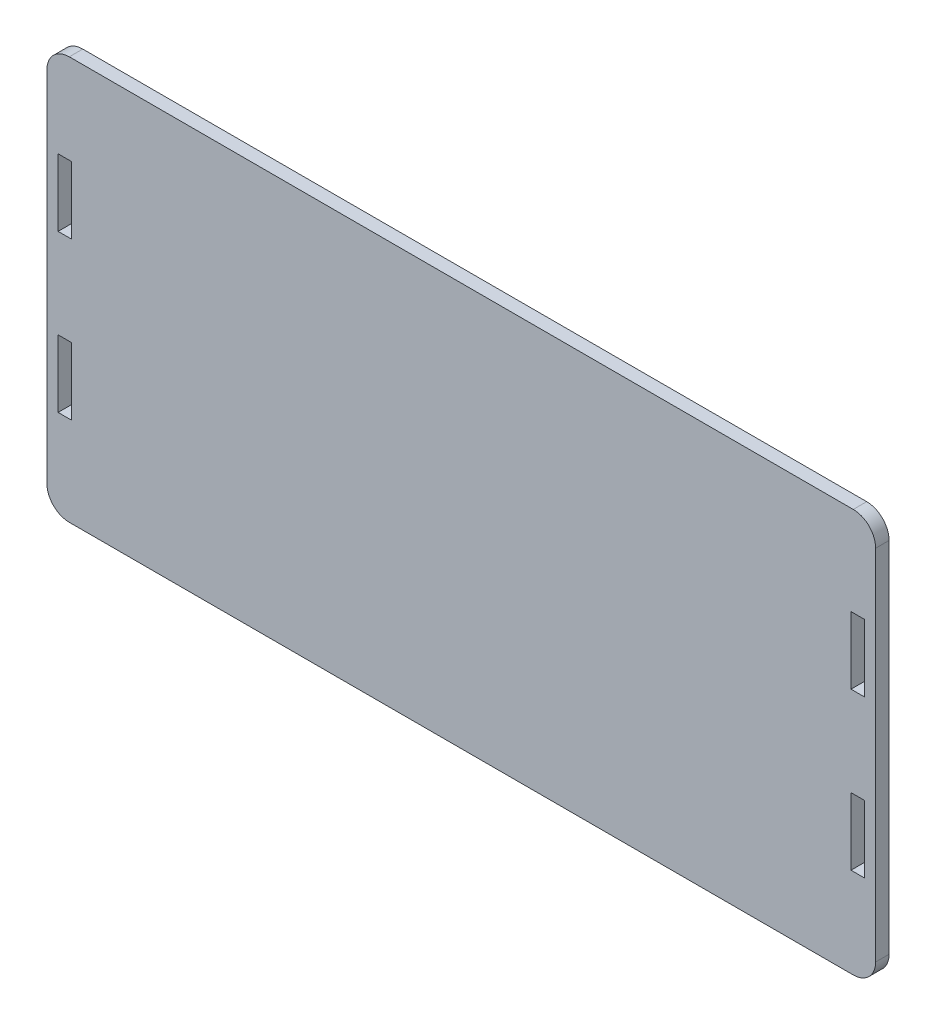
ISO-10303-21;
HEADER;
FILE_DESCRIPTION(('STEP AP214'),'2;1');
FILE_NAME('part.step','',(''),(''),'','','');
FILE_SCHEMA(('AUTOMOTIVE_DESIGN { 1 0 10303 214 1 1 1 1 }'));
ENDSEC;
DATA;
#1=APPLICATION_CONTEXT('core data for automotive mechanical design processes');
#2=APPLICATION_PROTOCOL_DEFINITION('international standard','automotive_design',2000,#1);
#3=PRODUCT_CONTEXT('',#1,'mechanical');
#4=PRODUCT('Part','Part','',(#3));
#5=PRODUCT_RELATED_PRODUCT_CATEGORY('part','',(#4));
#6=PRODUCT_DEFINITION_FORMATION('','',#4);
#7=PRODUCT_DEFINITION_CONTEXT('part definition',#1,'design');
#8=PRODUCT_DEFINITION('design','',#6,#7);
#9=PRODUCT_DEFINITION_SHAPE('','',#8);
#10=(LENGTH_UNIT() NAMED_UNIT(*) SI_UNIT(.MILLI.,.METRE.));
#11=(NAMED_UNIT(*) PLANE_ANGLE_UNIT() SI_UNIT($,.RADIAN.));
#12=(NAMED_UNIT(*) SI_UNIT($,.STERADIAN.) SOLID_ANGLE_UNIT());
#13=UNCERTAINTY_MEASURE_WITH_UNIT(LENGTH_MEASURE(1.E-05),#10,'distance_accuracy_value','');
#14=(GEOMETRIC_REPRESENTATION_CONTEXT(3) GLOBAL_UNCERTAINTY_ASSIGNED_CONTEXT((#13)) GLOBAL_UNIT_ASSIGNED_CONTEXT((#10,
#11,#12)) REPRESENTATION_CONTEXT('',''));
#15=CARTESIAN_POINT('',(0.,0.,0.));
#16=DIRECTION('',(0.,0.,1.));
#17=DIRECTION('',(1.,0.,0.));
#18=AXIS2_PLACEMENT_3D('',#15,#16,#17);
#19=CARTESIAN_POINT('',(0.,0.,6.));
#20=DIRECTION('',(1.,0.,0.));
#21=DIRECTION('',(0.,0.,-1.));
#22=AXIS2_PLACEMENT_3D('',#19,#20,#21);
#23=PLANE('',#22);
#24=DIRECTION('',(0.,-1.,0.));
#25=VECTOR('',#24,1.);
#26=CARTESIAN_POINT('',(0.,0.,6.));
#27=LINE('',#26,#25);
#28=CARTESIAN_POINT('',(0.,170.,6.));
#29=VERTEX_POINT('',#28);
#30=CARTESIAN_POINT('',(0.,10.,6.));
#31=VERTEX_POINT('',#30);
#32=EDGE_CURVE('E290',#29,#31,#27,.T.);
#33=ORIENTED_EDGE('',*,*,#32,.F.);
#34=DIRECTION('',(0.,0.,-1.));
#35=VECTOR('',#34,1.);
#36=CARTESIAN_POINT('',(0.,170.,6.));
#37=LINE('',#36,#35);
#38=CARTESIAN_POINT('',(0.,170.,0.));
#39=VERTEX_POINT('',#38);
#40=EDGE_CURVE('E346',#29,#39,#37,.T.);
#41=ORIENTED_EDGE('',*,*,#40,.T.);
#42=DIRECTION('',(0.,-1.,0.));
#43=VECTOR('',#42,1.);
#44=CARTESIAN_POINT('',(0.,0.,0.));
#45=LINE('',#44,#43);
#46=CARTESIAN_POINT('',(0.,10.,0.));
#47=VERTEX_POINT('',#46);
#48=EDGE_CURVE('E283',#39,#47,#45,.T.);
#49=ORIENTED_EDGE('',*,*,#48,.T.);
#50=DIRECTION('',(0.,0.,-1.));
#51=VECTOR('',#50,1.);
#52=CARTESIAN_POINT('',(0.,10.,6.));
#53=LINE('',#52,#51);
#54=EDGE_CURVE('E344',#47,#31,#53,.F.);
#55=ORIENTED_EDGE('',*,*,#54,.T.);
#56=EDGE_LOOP('',(#33,#41,#49,#55));
#57=FACE_BOUND('',#56,.T.);
#58=ADVANCED_FACE('F33',(#57),#23,.F.);
#59=CARTESIAN_POINT('',(0.,0.,6.));
#60=DIRECTION('',(0.,1.,0.));
#61=DIRECTION('',(0.,0.,1.));
#62=AXIS2_PLACEMENT_3D('',#59,#60,#61);
#63=PLANE('',#62);
#64=DIRECTION('',(1.,0.,0.));
#65=VECTOR('',#64,1.);
#66=CARTESIAN_POINT('',(0.,0.,6.));
#67=LINE('',#66,#65);
#68=CARTESIAN_POINT('',(10.,0.,6.));
#69=VERTEX_POINT('',#68);
#70=CARTESIAN_POINT('',(360.,0.,6.));
#71=VERTEX_POINT('',#70);
#72=EDGE_CURVE('E293',#69,#71,#67,.T.);
#73=ORIENTED_EDGE('',*,*,#72,.F.);
#74=DIRECTION('',(0.,0.,-1.));
#75=VECTOR('',#74,1.);
#76=CARTESIAN_POINT('',(10.,0.,6.));
#77=LINE('',#76,#75);
#78=CARTESIAN_POINT('',(10.,0.,0.));
#79=VERTEX_POINT('',#78);
#80=EDGE_CURVE('E371',#69,#79,#77,.T.);
#81=ORIENTED_EDGE('',*,*,#80,.T.);
#82=DIRECTION('',(1.,0.,0.));
#83=VECTOR('',#82,1.);
#84=CARTESIAN_POINT('',(0.,0.,0.));
#85=LINE('',#84,#83);
#86=CARTESIAN_POINT('',(360.,0.,0.));
#87=VERTEX_POINT('',#86);
#88=EDGE_CURVE('E304',#79,#87,#85,.T.);
#89=ORIENTED_EDGE('',*,*,#88,.T.);
#90=DIRECTION('',(0.,0.,-1.));
#91=VECTOR('',#90,1.);
#92=CARTESIAN_POINT('',(360.,0.,6.));
#93=LINE('',#92,#91);
#94=EDGE_CURVE('E369',#87,#71,#93,.F.);
#95=ORIENTED_EDGE('',*,*,#94,.T.);
#96=EDGE_LOOP('',(#73,#81,#89,#95));
#97=FACE_BOUND('',#96,.T.);
#98=ADVANCED_FACE('F404',(#97),#63,.F.);
#99=CARTESIAN_POINT('',(370.,0.,6.));
#100=DIRECTION('',(-1.,0.,0.));
#101=DIRECTION('',(0.,0.,1.));
#102=AXIS2_PLACEMENT_3D('',#99,#100,#101);
#103=PLANE('',#102);
#104=DIRECTION('',(0.,1.,0.));
#105=VECTOR('',#104,1.);
#106=CARTESIAN_POINT('',(370.,0.,0.));
#107=LINE('',#106,#105);
#108=CARTESIAN_POINT('',(370.,10.,0.));
#109=VERTEX_POINT('',#108);
#110=CARTESIAN_POINT('',(370.,170.,0.));
#111=VERTEX_POINT('',#110);
#112=EDGE_CURVE('E307',#109,#111,#107,.T.);
#113=ORIENTED_EDGE('',*,*,#112,.T.);
#114=DIRECTION('',(0.,0.,-1.));
#115=VECTOR('',#114,1.);
#116=CARTESIAN_POINT('',(370.,170.,6.));
#117=LINE('',#116,#115);
#118=CARTESIAN_POINT('',(370.,170.,6.));
#119=VERTEX_POINT('',#118);
#120=EDGE_CURVE('E11',#111,#119,#117,.F.);
#121=ORIENTED_EDGE('',*,*,#120,.T.);
#122=DIRECTION('',(0.,1.,0.));
#123=VECTOR('',#122,1.);
#124=CARTESIAN_POINT('',(370.,0.,6.));
#125=LINE('',#124,#123);
#126=CARTESIAN_POINT('',(370.,10.,6.));
#127=VERTEX_POINT('',#126);
#128=EDGE_CURVE('E296',#127,#119,#125,.T.);
#129=ORIENTED_EDGE('',*,*,#128,.F.);
#130=DIRECTION('',(0.,0.,-1.));
#131=VECTOR('',#130,1.);
#132=CARTESIAN_POINT('',(370.,10.,6.));
#133=LINE('',#132,#131);
#134=EDGE_CURVE('E41',#127,#109,#133,.T.);
#135=ORIENTED_EDGE('',*,*,#134,.T.);
#136=EDGE_LOOP('',(#113,#121,#129,#135));
#137=FACE_BOUND('',#136,.T.);
#138=ADVANCED_FACE('F376',(#137),#103,.F.);
#139=CARTESIAN_POINT('',(0.,180.,6.));
#140=DIRECTION('',(0.,-1.,0.));
#141=DIRECTION('',(0.,0.,-1.));
#142=AXIS2_PLACEMENT_3D('',#139,#140,#141);
#143=PLANE('',#142);
#144=DIRECTION('',(-1.,0.,0.));
#145=VECTOR('',#144,1.);
#146=CARTESIAN_POINT('',(0.,180.,0.));
#147=LINE('',#146,#145);
#148=CARTESIAN_POINT('',(360.,180.,0.));
#149=VERTEX_POINT('',#148);
#150=CARTESIAN_POINT('',(10.,180.,0.));
#151=VERTEX_POINT('',#150);
#152=EDGE_CURVE('E294',#149,#151,#147,.T.);
#153=ORIENTED_EDGE('',*,*,#152,.T.);
#154=DIRECTION('',(0.,0.,-1.));
#155=VECTOR('',#154,1.);
#156=CARTESIAN_POINT('',(10.,180.,6.));
#157=LINE('',#156,#155);
#158=CARTESIAN_POINT('',(10.,180.,6.));
#159=VERTEX_POINT('',#158);
#160=EDGE_CURVE('E360',#151,#159,#157,.F.);
#161=ORIENTED_EDGE('',*,*,#160,.T.);
#162=DIRECTION('',(-1.,0.,0.));
#163=VECTOR('',#162,1.);
#164=CARTESIAN_POINT('',(0.,180.,6.));
#165=LINE('',#164,#163);
#166=CARTESIAN_POINT('',(360.,180.,6.));
#167=VERTEX_POINT('',#166);
#168=EDGE_CURVE('E298',#167,#159,#165,.T.);
#169=ORIENTED_EDGE('',*,*,#168,.F.);
#170=DIRECTION('',(0.,0.,-1.));
#171=VECTOR('',#170,1.);
#172=CARTESIAN_POINT('',(360.,180.,6.));
#173=LINE('',#172,#171);
#174=EDGE_CURVE('E357',#167,#149,#173,.T.);
#175=ORIENTED_EDGE('',*,*,#174,.T.);
#176=EDGE_LOOP('',(#153,#161,#169,#175));
#177=FACE_BOUND('',#176,.T.);
#178=ADVANCED_FACE('F389',(#177),#143,.F.);
#179=CARTESIAN_POINT('',(0.,0.,6.));
#180=DIRECTION('',(0.,0.,-1.));
#181=DIRECTION('',(-1.,0.,0.));
#182=AXIS2_PLACEMENT_3D('',#179,#180,#181);
#183=PLANE('',#182);
#184=DIRECTION('',(0.,1.,0.));
#185=VECTOR('',#184,1.);
#186=CARTESIAN_POINT('',(365.,40.0000000000001,6.));
#187=LINE('',#186,#185);
#188=CARTESIAN_POINT('',(365.,40.0000000000001,6.));
#189=VERTEX_POINT('',#188);
#190=CARTESIAN_POINT('',(365.,70.0000000000001,6.));
#191=VERTEX_POINT('',#190);
#192=EDGE_CURVE('E210',#189,#191,#187,.T.);
#193=ORIENTED_EDGE('',*,*,#192,.F.);
#194=DIRECTION('',(1.,0.,0.));
#195=VECTOR('',#194,1.);
#196=CARTESIAN_POINT('',(365.,40.0000000000001,6.));
#197=LINE('',#196,#195);
#198=CARTESIAN_POINT('',(359.,40.0000000000001,6.));
#199=VERTEX_POINT('',#198);
#200=EDGE_CURVE('E215',#199,#189,#197,.T.);
#201=ORIENTED_EDGE('',*,*,#200,.F.);
#202=DIRECTION('',(0.,-1.,0.));
#203=VECTOR('',#202,1.);
#204=CARTESIAN_POINT('',(359.,40.0000000000001,6.));
#205=LINE('',#204,#203);
#206=CARTESIAN_POINT('',(359.,70.0000000000001,6.));
#207=VERTEX_POINT('',#206);
#208=EDGE_CURVE('E220',#207,#199,#205,.T.);
#209=ORIENTED_EDGE('',*,*,#208,.F.);
#210=DIRECTION('',(-1.,0.,0.));
#211=VECTOR('',#210,1.);
#212=CARTESIAN_POINT('',(365.,70.0000000000001,6.));
#213=LINE('',#212,#211);
#214=EDGE_CURVE('E199',#191,#207,#213,.T.);
#215=ORIENTED_EDGE('',*,*,#214,.F.);
#216=EDGE_LOOP('',(#193,#201,#209,#215));
#217=FACE_BOUND('',#216,.T.);
#218=DIRECTION('',(0.,1.,0.));
#219=VECTOR('',#218,1.);
#220=CARTESIAN_POINT('',(365.,110.,6.));
#221=LINE('',#220,#219);
#222=CARTESIAN_POINT('',(365.,110.,6.));
#223=VERTEX_POINT('',#222);
#224=CARTESIAN_POINT('',(365.,140.,6.));
#225=VERTEX_POINT('',#224);
#226=EDGE_CURVE('E231',#223,#225,#221,.T.);
#227=ORIENTED_EDGE('',*,*,#226,.F.);
#228=DIRECTION('',(1.,0.,0.));
#229=VECTOR('',#228,1.);
#230=CARTESIAN_POINT('',(359.,110.,6.));
#231=LINE('',#230,#229);
#232=CARTESIAN_POINT('',(359.,110.,6.));
#233=VERTEX_POINT('',#232);
#234=EDGE_CURVE('E227',#233,#223,#231,.T.);
#235=ORIENTED_EDGE('',*,*,#234,.F.);
#236=DIRECTION('',(0.,-1.,0.));
#237=VECTOR('',#236,1.);
#238=CARTESIAN_POINT('',(359.,110.,6.));
#239=LINE('',#238,#237);
#240=CARTESIAN_POINT('',(359.,140.,6.));
#241=VERTEX_POINT('',#240);
#242=EDGE_CURVE('E237',#241,#233,#239,.T.);
#243=ORIENTED_EDGE('',*,*,#242,.F.);
#244=DIRECTION('',(-1.,0.,0.));
#245=VECTOR('',#244,1.);
#246=CARTESIAN_POINT('',(359.,140.,6.));
#247=LINE('',#246,#245);
#248=EDGE_CURVE('E234',#225,#241,#247,.T.);
#249=ORIENTED_EDGE('',*,*,#248,.F.);
#250=EDGE_LOOP('',(#227,#235,#243,#249));
#251=FACE_BOUND('',#250,.T.);
#252=DIRECTION('',(-1.,0.,0.));
#253=VECTOR('',#252,1.);
#254=CARTESIAN_POINT('',(11.,140.,6.));
#255=LINE('',#254,#253);
#256=CARTESIAN_POINT('',(11.,140.,6.));
#257=VERTEX_POINT('',#256);
#258=CARTESIAN_POINT('',(5.,140.,6.));
#259=VERTEX_POINT('',#258);
#260=EDGE_CURVE('E251',#257,#259,#255,.T.);
#261=ORIENTED_EDGE('',*,*,#260,.F.);
#262=DIRECTION('',(0.,1.,0.));
#263=VECTOR('',#262,1.);
#264=CARTESIAN_POINT('',(11.,110.,6.));
#265=LINE('',#264,#263);
#266=CARTESIAN_POINT('',(11.,110.,6.));
#267=VERTEX_POINT('',#266);
#268=EDGE_CURVE('E243',#267,#257,#265,.T.);
#269=ORIENTED_EDGE('',*,*,#268,.F.);
#270=DIRECTION('',(1.,0.,0.));
#271=VECTOR('',#270,1.);
#272=CARTESIAN_POINT('',(11.,110.,6.));
#273=LINE('',#272,#271);
#274=CARTESIAN_POINT('',(5.,110.,6.));
#275=VERTEX_POINT('',#274);
#276=EDGE_CURVE('E257',#275,#267,#273,.T.);
#277=ORIENTED_EDGE('',*,*,#276,.F.);
#278=DIRECTION('',(0.,-1.,0.));
#279=VECTOR('',#278,1.);
#280=CARTESIAN_POINT('',(5.,110.,6.));
#281=LINE('',#280,#279);
#282=EDGE_CURVE('E254',#259,#275,#281,.T.);
#283=ORIENTED_EDGE('',*,*,#282,.F.);
#284=EDGE_LOOP('',(#261,#269,#277,#283));
#285=FACE_BOUND('',#284,.T.);
#286=DIRECTION('',(1.,0.,0.));
#287=VECTOR('',#286,1.);
#288=CARTESIAN_POINT('',(5.,40.,6.));
#289=LINE('',#288,#287);
#290=CARTESIAN_POINT('',(5.,40.,6.));
#291=VERTEX_POINT('',#290);
#292=CARTESIAN_POINT('',(11.,40.,6.));
#293=VERTEX_POINT('',#292);
#294=EDGE_CURVE('E271',#291,#293,#289,.T.);
#295=ORIENTED_EDGE('',*,*,#294,.F.);
#296=DIRECTION('',(0.,-1.,0.));
#297=VECTOR('',#296,1.);
#298=CARTESIAN_POINT('',(5.,40.,6.));
#299=LINE('',#298,#297);
#300=CARTESIAN_POINT('',(5.,70.,6.));
#301=VERTEX_POINT('',#300);
#302=EDGE_CURVE('E263',#301,#291,#299,.T.);
#303=ORIENTED_EDGE('',*,*,#302,.F.);
#304=DIRECTION('',(-1.,0.,0.));
#305=VECTOR('',#304,1.);
#306=CARTESIAN_POINT('',(5.,70.,6.));
#307=LINE('',#306,#305);
#308=CARTESIAN_POINT('',(11.,70.,6.));
#309=VERTEX_POINT('',#308);
#310=EDGE_CURVE('E277',#309,#301,#307,.T.);
#311=ORIENTED_EDGE('',*,*,#310,.F.);
#312=DIRECTION('',(0.,1.,0.));
#313=VECTOR('',#312,1.);
#314=CARTESIAN_POINT('',(11.,40.,6.));
#315=LINE('',#314,#313);
#316=EDGE_CURVE('E274',#293,#309,#315,.T.);
#317=ORIENTED_EDGE('',*,*,#316,.F.);
#318=EDGE_LOOP('',(#295,#303,#311,#317));
#319=FACE_BOUND('',#318,.T.);
#320=ORIENTED_EDGE('',*,*,#168,.T.);
#321=CARTESIAN_POINT('',(10.,170.,6.));
#322=DIRECTION('',(0.,0.,-1.));
#323=DIRECTION('',(-1.,0.,0.));
#324=AXIS2_PLACEMENT_3D('',#321,#322,#323);
#325=CIRCLE('',#324,10.);
#326=EDGE_CURVE('E367',#159,#29,#325,.F.);
#327=ORIENTED_EDGE('',*,*,#326,.T.);
#328=ORIENTED_EDGE('',*,*,#32,.T.);
#329=CARTESIAN_POINT('',(10.,10.,6.));
#330=DIRECTION('',(0.,0.,-1.));
#331=DIRECTION('',(-1.,0.,0.));
#332=AXIS2_PLACEMENT_3D('',#329,#330,#331);
#333=CIRCLE('',#332,10.);
#334=EDGE_CURVE('E365',#31,#69,#333,.F.);
#335=ORIENTED_EDGE('',*,*,#334,.T.);
#336=ORIENTED_EDGE('',*,*,#72,.T.);
#337=CARTESIAN_POINT('',(360.,10.,6.));
#338=DIRECTION('',(0.,0.,-1.));
#339=DIRECTION('',(-1.,0.,0.));
#340=AXIS2_PLACEMENT_3D('',#337,#338,#339);
#341=CIRCLE('',#340,10.);
#342=EDGE_CURVE('E53',#71,#127,#341,.F.);
#343=ORIENTED_EDGE('',*,*,#342,.T.);
#344=ORIENTED_EDGE('',*,*,#128,.T.);
#345=CARTESIAN_POINT('',(360.,170.,6.));
#346=DIRECTION('',(0.,0.,-1.));
#347=DIRECTION('',(-1.,0.,0.));
#348=AXIS2_PLACEMENT_3D('',#345,#346,#347);
#349=CIRCLE('',#348,10.);
#350=EDGE_CURVE('E363',#119,#167,#349,.F.);
#351=ORIENTED_EDGE('',*,*,#350,.T.);
#352=EDGE_LOOP('',(#320,#327,#328,#335,#336,#343,#344,#351));
#353=FACE_BOUND('',#352,.T.);
#354=ADVANCED_FACE('F217',(#217,#251,#285,#319,#353),#183,.F.);
#355=CARTESIAN_POINT('',(0.,0.,0.));
#356=DIRECTION('',(0.,0.,-1.));
#357=DIRECTION('',(-1.,0.,0.));
#358=AXIS2_PLACEMENT_3D('',#355,#356,#357);
#359=PLANE('',#358);
#360=DIRECTION('',(-1.,0.,0.));
#361=VECTOR('',#360,1.);
#362=CARTESIAN_POINT('',(0.,40.0000000000001,0.));
#363=LINE('',#362,#361);
#364=CARTESIAN_POINT('',(365.,40.0000000000001,0.));
#365=VERTEX_POINT('',#364);
#366=CARTESIAN_POINT('',(359.,40.0000000000001,0.));
#367=VERTEX_POINT('',#366);
#368=EDGE_CURVE('E342',#365,#367,#363,.T.);
#369=ORIENTED_EDGE('',*,*,#368,.F.);
#370=DIRECTION('',(0.,-1.,0.));
#371=VECTOR('',#370,1.);
#372=CARTESIAN_POINT('',(365.,0.,0.));
#373=LINE('',#372,#371);
#374=CARTESIAN_POINT('',(365.,70.0000000000001,0.));
#375=VERTEX_POINT('',#374);
#376=EDGE_CURVE('E337',#375,#365,#373,.T.);
#377=ORIENTED_EDGE('',*,*,#376,.F.);
#378=DIRECTION('',(1.,0.,0.));
#379=VECTOR('',#378,1.);
#380=CARTESIAN_POINT('',(0.,70.0000000000001,0.));
#381=LINE('',#380,#379);
#382=CARTESIAN_POINT('',(359.,70.0000000000001,0.));
#383=VERTEX_POINT('',#382);
#384=EDGE_CURVE('E202',#383,#375,#381,.T.);
#385=ORIENTED_EDGE('',*,*,#384,.F.);
#386=DIRECTION('',(0.,1.,0.));
#387=VECTOR('',#386,1.);
#388=CARTESIAN_POINT('',(359.,0.,0.));
#389=LINE('',#388,#387);
#390=EDGE_CURVE('E340',#367,#383,#389,.T.);
#391=ORIENTED_EDGE('',*,*,#390,.F.);
#392=EDGE_LOOP('',(#369,#377,#385,#391));
#393=FACE_BOUND('',#392,.T.);
#394=DIRECTION('',(-1.,0.,0.));
#395=VECTOR('',#394,1.);
#396=CARTESIAN_POINT('',(0.,110.,0.));
#397=LINE('',#396,#395);
#398=CARTESIAN_POINT('',(365.,110.,0.));
#399=VERTEX_POINT('',#398);
#400=CARTESIAN_POINT('',(359.,110.,0.));
#401=VERTEX_POINT('',#400);
#402=EDGE_CURVE('E335',#399,#401,#397,.T.);
#403=ORIENTED_EDGE('',*,*,#402,.F.);
#404=DIRECTION('',(0.,-1.,0.));
#405=VECTOR('',#404,1.);
#406=CARTESIAN_POINT('',(365.,0.,0.));
#407=LINE('',#406,#405);
#408=CARTESIAN_POINT('',(365.,140.,0.));
#409=VERTEX_POINT('',#408);
#410=EDGE_CURVE('E328',#409,#399,#407,.T.);
#411=ORIENTED_EDGE('',*,*,#410,.F.);
#412=DIRECTION('',(1.,0.,0.));
#413=VECTOR('',#412,1.);
#414=CARTESIAN_POINT('',(0.,140.,0.));
#415=LINE('',#414,#413);
#416=CARTESIAN_POINT('',(359.,140.,0.));
#417=VERTEX_POINT('',#416);
#418=EDGE_CURVE('E330',#417,#409,#415,.T.);
#419=ORIENTED_EDGE('',*,*,#418,.F.);
#420=DIRECTION('',(0.,1.,0.));
#421=VECTOR('',#420,1.);
#422=CARTESIAN_POINT('',(359.,0.,0.));
#423=LINE('',#422,#421);
#424=EDGE_CURVE('E333',#401,#417,#423,.T.);
#425=ORIENTED_EDGE('',*,*,#424,.F.);
#426=EDGE_LOOP('',(#403,#411,#419,#425));
#427=FACE_BOUND('',#426,.T.);
#428=DIRECTION('',(0.,-1.,0.));
#429=VECTOR('',#428,1.);
#430=CARTESIAN_POINT('',(11.,0.,0.));
#431=LINE('',#430,#429);
#432=CARTESIAN_POINT('',(11.,140.,0.));
#433=VERTEX_POINT('',#432);
#434=CARTESIAN_POINT('',(11.,110.,0.));
#435=VERTEX_POINT('',#434);
#436=EDGE_CURVE('E326',#433,#435,#431,.T.);
#437=ORIENTED_EDGE('',*,*,#436,.F.);
#438=DIRECTION('',(1.,0.,0.));
#439=VECTOR('',#438,1.);
#440=CARTESIAN_POINT('',(0.,140.,0.));
#441=LINE('',#440,#439);
#442=CARTESIAN_POINT('',(5.,140.,0.));
#443=VERTEX_POINT('',#442);
#444=EDGE_CURVE('E319',#443,#433,#441,.T.);
#445=ORIENTED_EDGE('',*,*,#444,.F.);
#446=DIRECTION('',(0.,1.,0.));
#447=VECTOR('',#446,1.);
#448=CARTESIAN_POINT('',(5.,0.,0.));
#449=LINE('',#448,#447);
#450=CARTESIAN_POINT('',(5.,110.,0.));
#451=VERTEX_POINT('',#450);
#452=EDGE_CURVE('E321',#451,#443,#449,.T.);
#453=ORIENTED_EDGE('',*,*,#452,.F.);
#454=DIRECTION('',(-1.,0.,0.));
#455=VECTOR('',#454,1.);
#456=CARTESIAN_POINT('',(0.,110.,0.));
#457=LINE('',#456,#455);
#458=EDGE_CURVE('E324',#435,#451,#457,.T.);
#459=ORIENTED_EDGE('',*,*,#458,.F.);
#460=EDGE_LOOP('',(#437,#445,#453,#459));
#461=FACE_BOUND('',#460,.T.);
#462=DIRECTION('',(0.,1.,0.));
#463=VECTOR('',#462,1.);
#464=CARTESIAN_POINT('',(5.,0.,0.));
#465=LINE('',#464,#463);
#466=CARTESIAN_POINT('',(5.,40.,0.));
#467=VERTEX_POINT('',#466);
#468=CARTESIAN_POINT('',(5.,70.,0.));
#469=VERTEX_POINT('',#468);
#470=EDGE_CURVE('E317',#467,#469,#465,.T.);
#471=ORIENTED_EDGE('',*,*,#470,.F.);
#472=DIRECTION('',(-1.,0.,0.));
#473=VECTOR('',#472,1.);
#474=CARTESIAN_POINT('',(0.,40.,0.));
#475=LINE('',#474,#473);
#476=CARTESIAN_POINT('',(11.,40.,0.));
#477=VERTEX_POINT('',#476);
#478=EDGE_CURVE('E301',#477,#467,#475,.T.);
#479=ORIENTED_EDGE('',*,*,#478,.F.);
#480=DIRECTION('',(0.,-1.,0.));
#481=VECTOR('',#480,1.);
#482=CARTESIAN_POINT('',(11.,0.,0.));
#483=LINE('',#482,#481);
#484=CARTESIAN_POINT('',(11.,70.,0.));
#485=VERTEX_POINT('',#484);
#486=EDGE_CURVE('E312',#485,#477,#483,.T.);
#487=ORIENTED_EDGE('',*,*,#486,.F.);
#488=DIRECTION('',(1.,0.,0.));
#489=VECTOR('',#488,1.);
#490=CARTESIAN_POINT('',(0.,70.,0.));
#491=LINE('',#490,#489);
#492=EDGE_CURVE('E315',#469,#485,#491,.T.);
#493=ORIENTED_EDGE('',*,*,#492,.F.);
#494=EDGE_LOOP('',(#471,#479,#487,#493));
#495=FACE_BOUND('',#494,.T.);
#496=ORIENTED_EDGE('',*,*,#48,.F.);
#497=CARTESIAN_POINT('',(10.,170.,0.));
#498=DIRECTION('',(0.,0.,-1.));
#499=DIRECTION('',(-1.,0.,0.));
#500=AXIS2_PLACEMENT_3D('',#497,#498,#499);
#501=CIRCLE('',#500,10.);
#502=EDGE_CURVE('E355',#39,#151,#501,.T.);
#503=ORIENTED_EDGE('',*,*,#502,.T.);
#504=ORIENTED_EDGE('',*,*,#152,.F.);
#505=CARTESIAN_POINT('',(360.,170.,0.));
#506=DIRECTION('',(0.,0.,-1.));
#507=DIRECTION('',(-1.,0.,0.));
#508=AXIS2_PLACEMENT_3D('',#505,#506,#507);
#509=CIRCLE('',#508,10.);
#510=EDGE_CURVE('E351',#149,#111,#509,.T.);
#511=ORIENTED_EDGE('',*,*,#510,.T.);
#512=ORIENTED_EDGE('',*,*,#112,.F.);
#513=CARTESIAN_POINT('',(360.,10.,0.));
#514=DIRECTION('',(0.,0.,-1.));
#515=DIRECTION('',(-1.,0.,0.));
#516=AXIS2_PLACEMENT_3D('',#513,#514,#515);
#517=CIRCLE('',#516,10.);
#518=EDGE_CURVE('E349',#109,#87,#517,.T.);
#519=ORIENTED_EDGE('',*,*,#518,.T.);
#520=ORIENTED_EDGE('',*,*,#88,.F.);
#521=CARTESIAN_POINT('',(10.,10.,0.));
#522=DIRECTION('',(0.,0.,-1.));
#523=DIRECTION('',(-1.,0.,0.));
#524=AXIS2_PLACEMENT_3D('',#521,#522,#523);
#525=CIRCLE('',#524,10.);
#526=EDGE_CURVE('E353',#79,#47,#525,.T.);
#527=ORIENTED_EDGE('',*,*,#526,.T.);
#528=EDGE_LOOP('',(#496,#503,#504,#511,#512,#519,#520,#527));
#529=FACE_BOUND('',#528,.T.);
#530=ADVANCED_FACE('F380',(#393,#427,#461,#495,#529),#359,.T.);
#531=CARTESIAN_POINT('',(5.,40.,-4.));
#532=DIRECTION('',(-1.,0.,0.));
#533=DIRECTION('',(0.,0.,1.));
#534=AXIS2_PLACEMENT_3D('',#531,#532,#533);
#535=PLANE('',#534);
#536=ORIENTED_EDGE('',*,*,#470,.T.);
#537=DIRECTION('',(0.,0.,1.));
#538=VECTOR('',#537,1.);
#539=CARTESIAN_POINT('',(5.,70.,-4.));
#540=LINE('',#539,#538);
#541=EDGE_CURVE('E281',#469,#301,#540,.T.);
#542=ORIENTED_EDGE('',*,*,#541,.T.);
#543=ORIENTED_EDGE('',*,*,#302,.T.);
#544=DIRECTION('',(0.,0.,1.));
#545=VECTOR('',#544,1.);
#546=CARTESIAN_POINT('',(5.,40.,-4.));
#547=LINE('',#546,#545);
#548=EDGE_CURVE('E280',#467,#291,#547,.T.);
#549=ORIENTED_EDGE('',*,*,#548,.F.);
#550=EDGE_LOOP('',(#536,#542,#543,#549));
#551=FACE_BOUND('',#550,.T.);
#552=ADVANCED_FACE('F573',(#551),#535,.F.);
#553=CARTESIAN_POINT('',(5.,70.,-4.));
#554=DIRECTION('',(0.,1.,0.));
#555=DIRECTION('',(0.,0.,1.));
#556=AXIS2_PLACEMENT_3D('',#553,#554,#555);
#557=PLANE('',#556);
#558=ORIENTED_EDGE('',*,*,#492,.T.);
#559=DIRECTION('',(0.,0.,1.));
#560=VECTOR('',#559,1.);
#561=CARTESIAN_POINT('',(11.,70.,-4.));
#562=LINE('',#561,#560);
#563=EDGE_CURVE('E284',#485,#309,#562,.T.);
#564=ORIENTED_EDGE('',*,*,#563,.T.);
#565=ORIENTED_EDGE('',*,*,#310,.T.);
#566=ORIENTED_EDGE('',*,*,#541,.F.);
#567=EDGE_LOOP('',(#558,#564,#565,#566));
#568=FACE_BOUND('',#567,.T.);
#569=ADVANCED_FACE('F564',(#568),#557,.F.);
#570=CARTESIAN_POINT('',(11.,40.,-4.));
#571=DIRECTION('',(1.,0.,0.));
#572=DIRECTION('',(0.,0.,-1.));
#573=AXIS2_PLACEMENT_3D('',#570,#571,#572);
#574=PLANE('',#573);
#575=ORIENTED_EDGE('',*,*,#486,.T.);
#576=DIRECTION('',(0.,0.,1.));
#577=VECTOR('',#576,1.);
#578=CARTESIAN_POINT('',(11.,40.,-4.));
#579=LINE('',#578,#577);
#580=EDGE_CURVE('E286',#477,#293,#579,.T.);
#581=ORIENTED_EDGE('',*,*,#580,.T.);
#582=ORIENTED_EDGE('',*,*,#316,.T.);
#583=ORIENTED_EDGE('',*,*,#563,.F.);
#584=EDGE_LOOP('',(#575,#581,#582,#583));
#585=FACE_BOUND('',#584,.T.);
#586=ADVANCED_FACE('F555',(#585),#574,.F.);
#587=CARTESIAN_POINT('',(5.,40.,-4.));
#588=DIRECTION('',(0.,-1.,0.));
#589=DIRECTION('',(0.,0.,-1.));
#590=AXIS2_PLACEMENT_3D('',#587,#588,#589);
#591=PLANE('',#590);
#592=ORIENTED_EDGE('',*,*,#478,.T.);
#593=ORIENTED_EDGE('',*,*,#548,.T.);
#594=ORIENTED_EDGE('',*,*,#294,.T.);
#595=ORIENTED_EDGE('',*,*,#580,.F.);
#596=EDGE_LOOP('',(#592,#593,#594,#595));
#597=FACE_BOUND('',#596,.T.);
#598=ADVANCED_FACE('F546',(#597),#591,.F.);
#599=CARTESIAN_POINT('',(11.,110.,-4.));
#600=DIRECTION('',(1.,0.,0.));
#601=DIRECTION('',(0.,0.,-1.));
#602=AXIS2_PLACEMENT_3D('',#599,#600,#601);
#603=PLANE('',#602);
#604=ORIENTED_EDGE('',*,*,#436,.T.);
#605=DIRECTION('',(0.,0.,1.));
#606=VECTOR('',#605,1.);
#607=CARTESIAN_POINT('',(11.,110.,-4.));
#608=LINE('',#607,#606);
#609=EDGE_CURVE('E261',#435,#267,#608,.T.);
#610=ORIENTED_EDGE('',*,*,#609,.T.);
#611=ORIENTED_EDGE('',*,*,#268,.T.);
#612=DIRECTION('',(0.,0.,1.));
#613=VECTOR('',#612,1.);
#614=CARTESIAN_POINT('',(11.,140.,-4.));
#615=LINE('',#614,#613);
#616=EDGE_CURVE('E260',#433,#257,#615,.T.);
#617=ORIENTED_EDGE('',*,*,#616,.F.);
#618=EDGE_LOOP('',(#604,#610,#611,#617));
#619=FACE_BOUND('',#618,.T.);
#620=ADVANCED_FACE('F537',(#619),#603,.F.);
#621=CARTESIAN_POINT('',(11.,110.,-4.));
#622=DIRECTION('',(0.,-1.,0.));
#623=DIRECTION('',(0.,0.,-1.));
#624=AXIS2_PLACEMENT_3D('',#621,#622,#623);
#625=PLANE('',#624);
#626=ORIENTED_EDGE('',*,*,#458,.T.);
#627=DIRECTION('',(0.,0.,1.));
#628=VECTOR('',#627,1.);
#629=CARTESIAN_POINT('',(5.,110.,-4.));
#630=LINE('',#629,#628);
#631=EDGE_CURVE('E264',#451,#275,#630,.T.);
#632=ORIENTED_EDGE('',*,*,#631,.T.);
#633=ORIENTED_EDGE('',*,*,#276,.T.);
#634=ORIENTED_EDGE('',*,*,#609,.F.);
#635=EDGE_LOOP('',(#626,#632,#633,#634));
#636=FACE_BOUND('',#635,.T.);
#637=ADVANCED_FACE('F528',(#636),#625,.F.);
#638=CARTESIAN_POINT('',(5.,110.,-4.));
#639=DIRECTION('',(-1.,0.,0.));
#640=DIRECTION('',(0.,0.,1.));
#641=AXIS2_PLACEMENT_3D('',#638,#639,#640);
#642=PLANE('',#641);
#643=ORIENTED_EDGE('',*,*,#452,.T.);
#644=DIRECTION('',(0.,0.,1.));
#645=VECTOR('',#644,1.);
#646=CARTESIAN_POINT('',(5.,140.,-4.));
#647=LINE('',#646,#645);
#648=EDGE_CURVE('E266',#443,#259,#647,.T.);
#649=ORIENTED_EDGE('',*,*,#648,.T.);
#650=ORIENTED_EDGE('',*,*,#282,.T.);
#651=ORIENTED_EDGE('',*,*,#631,.F.);
#652=EDGE_LOOP('',(#643,#649,#650,#651));
#653=FACE_BOUND('',#652,.T.);
#654=ADVANCED_FACE('F519',(#653),#642,.F.);
#655=CARTESIAN_POINT('',(11.,140.,-4.));
#656=DIRECTION('',(0.,1.,0.));
#657=DIRECTION('',(0.,0.,1.));
#658=AXIS2_PLACEMENT_3D('',#655,#656,#657);
#659=PLANE('',#658);
#660=ORIENTED_EDGE('',*,*,#444,.T.);
#661=ORIENTED_EDGE('',*,*,#616,.T.);
#662=ORIENTED_EDGE('',*,*,#260,.T.);
#663=ORIENTED_EDGE('',*,*,#648,.F.);
#664=EDGE_LOOP('',(#660,#661,#662,#663));
#665=FACE_BOUND('',#664,.T.);
#666=ADVANCED_FACE('F510',(#665),#659,.F.);
#667=CARTESIAN_POINT('',(359.,110.,-4.));
#668=DIRECTION('',(0.,-1.,0.));
#669=DIRECTION('',(0.,0.,-1.));
#670=AXIS2_PLACEMENT_3D('',#667,#668,#669);
#671=PLANE('',#670);
#672=ORIENTED_EDGE('',*,*,#402,.T.);
#673=DIRECTION('',(0.,0.,1.));
#674=VECTOR('',#673,1.);
#675=CARTESIAN_POINT('',(359.,110.,-4.));
#676=LINE('',#675,#674);
#677=EDGE_CURVE('E241',#401,#233,#676,.T.);
#678=ORIENTED_EDGE('',*,*,#677,.T.);
#679=ORIENTED_EDGE('',*,*,#234,.T.);
#680=DIRECTION('',(0.,0.,1.));
#681=VECTOR('',#680,1.);
#682=CARTESIAN_POINT('',(365.,110.,-4.));
#683=LINE('',#682,#681);
#684=EDGE_CURVE('E240',#399,#223,#683,.T.);
#685=ORIENTED_EDGE('',*,*,#684,.F.);
#686=EDGE_LOOP('',(#672,#678,#679,#685));
#687=FACE_BOUND('',#686,.T.);
#688=ADVANCED_FACE('F501',(#687),#671,.F.);
#689=CARTESIAN_POINT('',(359.,110.,-4.));
#690=DIRECTION('',(-1.,0.,0.));
#691=DIRECTION('',(0.,0.,1.));
#692=AXIS2_PLACEMENT_3D('',#689,#690,#691);
#693=PLANE('',#692);
#694=ORIENTED_EDGE('',*,*,#424,.T.);
#695=DIRECTION('',(0.,0.,1.));
#696=VECTOR('',#695,1.);
#697=CARTESIAN_POINT('',(359.,140.,-4.));
#698=LINE('',#697,#696);
#699=EDGE_CURVE('E244',#417,#241,#698,.T.);
#700=ORIENTED_EDGE('',*,*,#699,.T.);
#701=ORIENTED_EDGE('',*,*,#242,.T.);
#702=ORIENTED_EDGE('',*,*,#677,.F.);
#703=EDGE_LOOP('',(#694,#700,#701,#702));
#704=FACE_BOUND('',#703,.T.);
#705=ADVANCED_FACE('F492',(#704),#693,.F.);
#706=CARTESIAN_POINT('',(359.,140.,-4.));
#707=DIRECTION('',(0.,1.,0.));
#708=DIRECTION('',(0.,0.,1.));
#709=AXIS2_PLACEMENT_3D('',#706,#707,#708);
#710=PLANE('',#709);
#711=ORIENTED_EDGE('',*,*,#418,.T.);
#712=DIRECTION('',(0.,0.,1.));
#713=VECTOR('',#712,1.);
#714=CARTESIAN_POINT('',(365.,140.,-4.));
#715=LINE('',#714,#713);
#716=EDGE_CURVE('E246',#409,#225,#715,.T.);
#717=ORIENTED_EDGE('',*,*,#716,.T.);
#718=ORIENTED_EDGE('',*,*,#248,.T.);
#719=ORIENTED_EDGE('',*,*,#699,.F.);
#720=EDGE_LOOP('',(#711,#717,#718,#719));
#721=FACE_BOUND('',#720,.T.);
#722=ADVANCED_FACE('F483',(#721),#710,.F.);
#723=CARTESIAN_POINT('',(365.,110.,-4.));
#724=DIRECTION('',(1.,0.,0.));
#725=DIRECTION('',(0.,0.,-1.));
#726=AXIS2_PLACEMENT_3D('',#723,#724,#725);
#727=PLANE('',#726);
#728=ORIENTED_EDGE('',*,*,#410,.T.);
#729=ORIENTED_EDGE('',*,*,#684,.T.);
#730=ORIENTED_EDGE('',*,*,#226,.T.);
#731=ORIENTED_EDGE('',*,*,#716,.F.);
#732=EDGE_LOOP('',(#728,#729,#730,#731));
#733=FACE_BOUND('',#732,.T.);
#734=ADVANCED_FACE('F474',(#733),#727,.F.);
#735=CARTESIAN_POINT('',(365.,40.0000000000001,-4.));
#736=DIRECTION('',(0.,-1.,0.));
#737=DIRECTION('',(0.,0.,-1.));
#738=AXIS2_PLACEMENT_3D('',#735,#736,#737);
#739=PLANE('',#738);
#740=ORIENTED_EDGE('',*,*,#368,.T.);
#741=DIRECTION('',(0.,0.,1.));
#742=VECTOR('',#741,1.);
#743=CARTESIAN_POINT('',(359.,40.0000000000001,-4.));
#744=LINE('',#743,#742);
#745=EDGE_CURVE('E225',#367,#199,#744,.T.);
#746=ORIENTED_EDGE('',*,*,#745,.T.);
#747=ORIENTED_EDGE('',*,*,#200,.T.);
#748=DIRECTION('',(0.,0.,1.));
#749=VECTOR('',#748,1.);
#750=CARTESIAN_POINT('',(365.,40.0000000000001,-4.));
#751=LINE('',#750,#749);
#752=EDGE_CURVE('E206',#365,#189,#751,.T.);
#753=ORIENTED_EDGE('',*,*,#752,.F.);
#754=EDGE_LOOP('',(#740,#746,#747,#753));
#755=FACE_BOUND('',#754,.T.);
#756=ADVANCED_FACE('F465',(#755),#739,.F.);
#757=CARTESIAN_POINT('',(359.,40.0000000000001,-4.));
#758=DIRECTION('',(-1.,0.,0.));
#759=DIRECTION('',(0.,0.,1.));
#760=AXIS2_PLACEMENT_3D('',#757,#758,#759);
#761=PLANE('',#760);
#762=ORIENTED_EDGE('',*,*,#390,.T.);
#763=DIRECTION('',(0.,0.,1.));
#764=VECTOR('',#763,1.);
#765=CARTESIAN_POINT('',(359.,70.0000000000001,-4.));
#766=LINE('',#765,#764);
#767=EDGE_CURVE('E205',#383,#207,#766,.T.);
#768=ORIENTED_EDGE('',*,*,#767,.T.);
#769=ORIENTED_EDGE('',*,*,#208,.T.);
#770=ORIENTED_EDGE('',*,*,#745,.F.);
#771=EDGE_LOOP('',(#762,#768,#769,#770));
#772=FACE_BOUND('',#771,.T.);
#773=ADVANCED_FACE('F457',(#772),#761,.F.);
#774=CARTESIAN_POINT('',(365.,70.0000000000001,-4.));
#775=DIRECTION('',(0.,1.,0.));
#776=DIRECTION('',(0.,0.,1.));
#777=AXIS2_PLACEMENT_3D('',#774,#775,#776);
#778=PLANE('',#777);
#779=ORIENTED_EDGE('',*,*,#384,.T.);
#780=DIRECTION('',(0.,0.,1.));
#781=VECTOR('',#780,1.);
#782=CARTESIAN_POINT('',(365.,70.0000000000001,-4.));
#783=LINE('',#782,#781);
#784=EDGE_CURVE('E194',#375,#191,#783,.T.);
#785=ORIENTED_EDGE('',*,*,#784,.T.);
#786=ORIENTED_EDGE('',*,*,#214,.T.);
#787=ORIENTED_EDGE('',*,*,#767,.F.);
#788=EDGE_LOOP('',(#779,#785,#786,#787));
#789=FACE_BOUND('',#788,.T.);
#790=ADVANCED_FACE('F196',(#789),#778,.F.);
#791=CARTESIAN_POINT('',(365.,40.0000000000001,-4.));
#792=DIRECTION('',(1.,0.,0.));
#793=DIRECTION('',(0.,0.,-1.));
#794=AXIS2_PLACEMENT_3D('',#791,#792,#793);
#795=PLANE('',#794);
#796=ORIENTED_EDGE('',*,*,#376,.T.);
#797=ORIENTED_EDGE('',*,*,#752,.T.);
#798=ORIENTED_EDGE('',*,*,#192,.T.);
#799=ORIENTED_EDGE('',*,*,#784,.F.);
#800=EDGE_LOOP('',(#796,#797,#798,#799));
#801=FACE_BOUND('',#800,.T.);
#802=ADVANCED_FACE('F211',(#801),#795,.F.);
#803=CARTESIAN_POINT('',(10.,170.,6.));
#804=DIRECTION('',(0.,0.,-1.));
#805=DIRECTION('',(-1.,0.,0.));
#806=AXIS2_PLACEMENT_3D('',#803,#804,#805);
#807=CYLINDRICAL_SURFACE('',#806,10.);
#808=ORIENTED_EDGE('',*,*,#326,.F.);
#809=ORIENTED_EDGE('',*,*,#160,.F.);
#810=ORIENTED_EDGE('',*,*,#502,.F.);
#811=ORIENTED_EDGE('',*,*,#40,.F.);
#812=EDGE_LOOP('',(#808,#809,#810,#811));
#813=FACE_BOUND('',#812,.T.);
#814=ADVANCED_FACE('F395',(#813),#807,.T.);
#815=CARTESIAN_POINT('',(10.,10.,6.));
#816=DIRECTION('',(0.,0.,-1.));
#817=DIRECTION('',(-1.,0.,0.));
#818=AXIS2_PLACEMENT_3D('',#815,#816,#817);
#819=CYLINDRICAL_SURFACE('',#818,10.);
#820=ORIENTED_EDGE('',*,*,#334,.F.);
#821=ORIENTED_EDGE('',*,*,#54,.F.);
#822=ORIENTED_EDGE('',*,*,#526,.F.);
#823=ORIENTED_EDGE('',*,*,#80,.F.);
#824=EDGE_LOOP('',(#820,#821,#822,#823));
#825=FACE_BOUND('',#824,.T.);
#826=ADVANCED_FACE('F401',(#825),#819,.T.);
#827=CARTESIAN_POINT('',(360.,170.,6.));
#828=DIRECTION('',(0.,0.,-1.));
#829=DIRECTION('',(-1.,0.,0.));
#830=AXIS2_PLACEMENT_3D('',#827,#828,#829);
#831=CYLINDRICAL_SURFACE('',#830,10.);
#832=ORIENTED_EDGE('',*,*,#350,.F.);
#833=ORIENTED_EDGE('',*,*,#120,.F.);
#834=ORIENTED_EDGE('',*,*,#510,.F.);
#835=ORIENTED_EDGE('',*,*,#174,.F.);
#836=EDGE_LOOP('',(#832,#833,#834,#835));
#837=FACE_BOUND('',#836,.T.);
#838=ADVANCED_FACE('F386',(#837),#831,.T.);
#839=CARTESIAN_POINT('',(360.,10.,6.));
#840=DIRECTION('',(0.,0.,-1.));
#841=DIRECTION('',(-1.,0.,0.));
#842=AXIS2_PLACEMENT_3D('',#839,#840,#841);
#843=CYLINDRICAL_SURFACE('',#842,10.);
#844=ORIENTED_EDGE('',*,*,#342,.F.);
#845=ORIENTED_EDGE('',*,*,#94,.F.);
#846=ORIENTED_EDGE('',*,*,#518,.F.);
#847=ORIENTED_EDGE('',*,*,#134,.F.);
#848=EDGE_LOOP('',(#844,#845,#846,#847));
#849=FACE_BOUND('',#848,.T.);
#850=ADVANCED_FACE('F35',(#849),#843,.T.);
#851=CLOSED_SHELL('',(#58,#98,#138,#178,#354,#530,#552,#569,#586,#598,#620,#637,#654,#666,#688,
#705,#722,#734,#756,#773,#790,#802,#814,#826,#838,#850));
#852=MANIFOLD_SOLID_BREP('B2',#851);
#853=ADVANCED_BREP_SHAPE_REPRESENTATION('',(#18,#852),#14);
#854=SHAPE_DEFINITION_REPRESENTATION(#9,#853);
ENDSEC;
END-ISO-10303-21;
